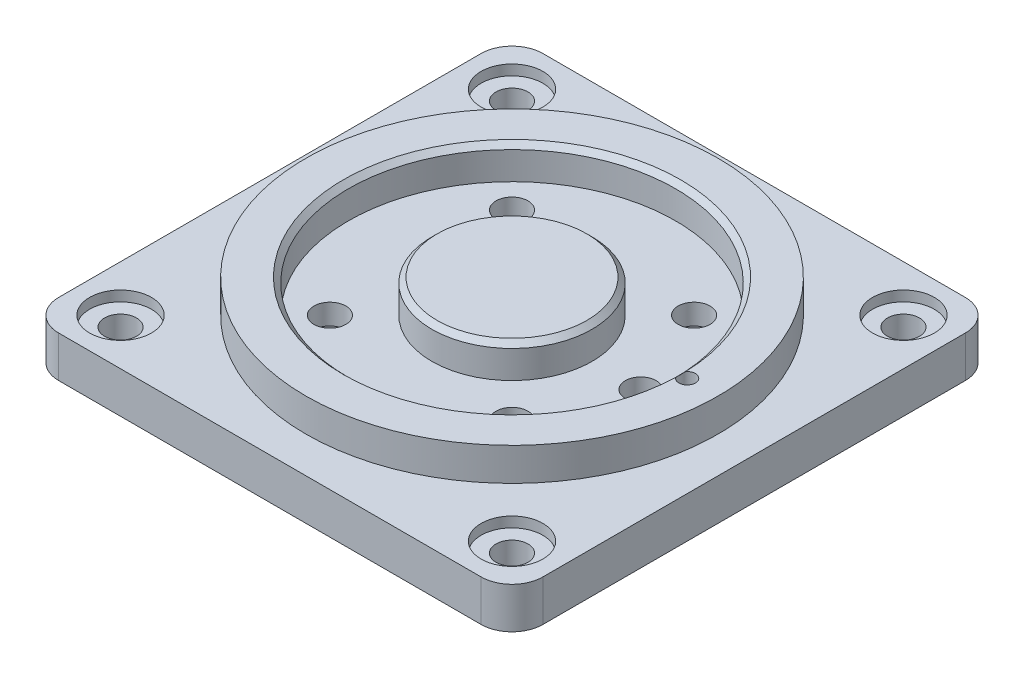
ISO-10303-21;
HEADER;
FILE_DESCRIPTION(('STEP AP214'),'2;1');
FILE_NAME('part.step','',(''),(''),'','','');
FILE_SCHEMA(('AUTOMOTIVE_DESIGN { 1 0 10303 214 1 1 1 1 }'));
ENDSEC;
DATA;
#1=APPLICATION_CONTEXT('core data for automotive mechanical design processes');
#2=APPLICATION_PROTOCOL_DEFINITION('international standard','automotive_design',2000,#1);
#3=PRODUCT_CONTEXT('',#1,'mechanical');
#4=PRODUCT('Part','Part','',(#3));
#5=PRODUCT_RELATED_PRODUCT_CATEGORY('part','',(#4));
#6=PRODUCT_DEFINITION_FORMATION('','',#4);
#7=PRODUCT_DEFINITION_CONTEXT('part definition',#1,'design');
#8=PRODUCT_DEFINITION('design','',#6,#7);
#9=PRODUCT_DEFINITION_SHAPE('','',#8);
#10=(LENGTH_UNIT() NAMED_UNIT(*) SI_UNIT(.MILLI.,.METRE.));
#11=(NAMED_UNIT(*) PLANE_ANGLE_UNIT() SI_UNIT($,.RADIAN.));
#12=(NAMED_UNIT(*) SI_UNIT($,.STERADIAN.) SOLID_ANGLE_UNIT());
#13=UNCERTAINTY_MEASURE_WITH_UNIT(LENGTH_MEASURE(1.E-05),#10,'distance_accuracy_value','');
#14=(GEOMETRIC_REPRESENTATION_CONTEXT(3) GLOBAL_UNCERTAINTY_ASSIGNED_CONTEXT((#13)) GLOBAL_UNIT_ASSIGNED_CONTEXT((#10,
#11,#12)) REPRESENTATION_CONTEXT('',''));
#15=CARTESIAN_POINT('',(0.,0.,0.));
#16=DIRECTION('',(0.,0.,1.));
#17=DIRECTION('',(1.,0.,0.));
#18=AXIS2_PLACEMENT_3D('',#15,#16,#17);
#19=CARTESIAN_POINT('',(-37.9999999999996,0.,-38.));
#20=DIRECTION('',(0.,1.,0.));
#21=DIRECTION('',(0.,0.,1.));
#22=AXIS2_PLACEMENT_3D('',#19,#20,#21);
#23=CYLINDRICAL_SURFACE('',#22,3.09999999999999);
#24=CARTESIAN_POINT('',(-37.9999999999996,0.,-38.));
#25=DIRECTION('',(0.,1.,0.));
#26=DIRECTION('',(0.,0.,1.));
#27=AXIS2_PLACEMENT_3D('',#24,#25,#26);
#28=CIRCLE('',#27,3.09999999999999);
#29=CARTESIAN_POINT('',(-37.9999999999996,0.,-34.9));
#30=VERTEX_POINT('',#29);
#31=EDGE_CURVE('E474',#30,#30,#28,.T.);
#32=ORIENTED_EDGE('',*,*,#31,.F.);
#33=EDGE_LOOP('',(#32));
#34=FACE_BOUND('',#33,.T.);
#35=CARTESIAN_POINT('',(-37.9999999999996,6.,-38.));
#36=DIRECTION('',(0.,1.,0.));
#37=DIRECTION('',(0.,0.,1.));
#38=AXIS2_PLACEMENT_3D('',#35,#36,#37);
#39=CIRCLE('',#38,3.09999999999999);
#40=CARTESIAN_POINT('',(-37.9999999999996,6.,-34.9));
#41=VERTEX_POINT('',#40);
#42=EDGE_CURVE('E50',#41,#41,#39,.F.);
#43=ORIENTED_EDGE('',*,*,#42,.F.);
#44=EDGE_LOOP('',(#43));
#45=FACE_BOUND('',#44,.T.);
#46=ADVANCED_FACE('F46',(#34,#45),#23,.F.);
#47=CARTESIAN_POINT('',(38.,0.,-38.0000000000019));
#48=DIRECTION('',(0.,1.,0.));
#49=DIRECTION('',(0.,0.,1.));
#50=AXIS2_PLACEMENT_3D('',#47,#48,#49);
#51=CYLINDRICAL_SURFACE('',#50,3.1);
#52=CARTESIAN_POINT('',(38.,0.,-38.0000000000019));
#53=DIRECTION('',(0.,1.,0.));
#54=DIRECTION('',(0.,0.,1.));
#55=AXIS2_PLACEMENT_3D('',#52,#53,#54);
#56=CIRCLE('',#55,3.1);
#57=CARTESIAN_POINT('',(38.,0.,-34.9000000000019));
#58=VERTEX_POINT('',#57);
#59=EDGE_CURVE('E471',#58,#58,#56,.T.);
#60=ORIENTED_EDGE('',*,*,#59,.F.);
#61=EDGE_LOOP('',(#60));
#62=FACE_BOUND('',#61,.T.);
#63=CARTESIAN_POINT('',(38.,6.,-38.0000000000019));
#64=DIRECTION('',(0.,1.,0.));
#65=DIRECTION('',(0.,0.,1.));
#66=AXIS2_PLACEMENT_3D('',#63,#64,#65);
#67=CIRCLE('',#66,3.1);
#68=CARTESIAN_POINT('',(38.,6.,-34.9000000000019));
#69=VERTEX_POINT('',#68);
#70=EDGE_CURVE('E610',#69,#69,#67,.F.);
#71=ORIENTED_EDGE('',*,*,#70,.F.);
#72=EDGE_LOOP('',(#71));
#73=FACE_BOUND('',#72,.T.);
#74=ADVANCED_FACE('F176',(#62,#73),#51,.F.);
#75=CARTESIAN_POINT('',(38.0000000000019,0.,37.9999999999977));
#76=DIRECTION('',(0.,1.,0.));
#77=DIRECTION('',(0.,0.,1.));
#78=AXIS2_PLACEMENT_3D('',#75,#76,#77);
#79=CYLINDRICAL_SURFACE('',#78,3.09999999999999);
#80=CARTESIAN_POINT('',(38.0000000000019,0.,37.9999999999977));
#81=DIRECTION('',(0.,1.,0.));
#82=DIRECTION('',(0.,0.,1.));
#83=AXIS2_PLACEMENT_3D('',#80,#81,#82);
#84=CIRCLE('',#83,3.09999999999999);
#85=CARTESIAN_POINT('',(38.0000000000019,0.,41.0999999999977));
#86=VERTEX_POINT('',#85);
#87=EDGE_CURVE('E475',#86,#86,#84,.T.);
#88=ORIENTED_EDGE('',*,*,#87,.F.);
#89=EDGE_LOOP('',(#88));
#90=FACE_BOUND('',#89,.T.);
#91=CARTESIAN_POINT('',(38.0000000000019,6.,37.9999999999977));
#92=DIRECTION('',(0.,1.,0.));
#93=DIRECTION('',(0.,0.,1.));
#94=AXIS2_PLACEMENT_3D('',#91,#92,#93);
#95=CIRCLE('',#94,3.09999999999999);
#96=CARTESIAN_POINT('',(38.0000000000019,6.,41.0999999999977));
#97=VERTEX_POINT('',#96);
#98=EDGE_CURVE('E608',#97,#97,#95,.F.);
#99=ORIENTED_EDGE('',*,*,#98,.F.);
#100=EDGE_LOOP('',(#99));
#101=FACE_BOUND('',#100,.T.);
#102=ADVANCED_FACE('F182',(#90,#101),#79,.F.);
#103=CARTESIAN_POINT('',(-37.9999999999977,0.,37.9999999999996));
#104=DIRECTION('',(0.,1.,0.));
#105=DIRECTION('',(0.,0.,1.));
#106=AXIS2_PLACEMENT_3D('',#103,#104,#105);
#107=CYLINDRICAL_SURFACE('',#106,3.09999999999999);
#108=CARTESIAN_POINT('',(-37.9999999999977,0.,37.9999999999996));
#109=DIRECTION('',(0.,1.,0.));
#110=DIRECTION('',(0.,0.,1.));
#111=AXIS2_PLACEMENT_3D('',#108,#109,#110);
#112=CIRCLE('',#111,3.09999999999999);
#113=CARTESIAN_POINT('',(-37.9999999999977,0.,41.0999999999996));
#114=VERTEX_POINT('',#113);
#115=EDGE_CURVE('E478',#114,#114,#112,.T.);
#116=ORIENTED_EDGE('',*,*,#115,.F.);
#117=EDGE_LOOP('',(#116));
#118=FACE_BOUND('',#117,.T.);
#119=CARTESIAN_POINT('',(-37.9999999999977,6.,37.9999999999996));
#120=DIRECTION('',(0.,1.,0.));
#121=DIRECTION('',(0.,0.,1.));
#122=AXIS2_PLACEMENT_3D('',#119,#120,#121);
#123=CIRCLE('',#122,3.09999999999999);
#124=CARTESIAN_POINT('',(-37.9999999999977,6.,41.0999999999996));
#125=VERTEX_POINT('',#124);
#126=EDGE_CURVE('E464',#125,#125,#123,.F.);
#127=ORIENTED_EDGE('',*,*,#126,.F.);
#128=EDGE_LOOP('',(#127));
#129=FACE_BOUND('',#128,.T.);
#130=ADVANCED_FACE('F189',(#118,#129),#107,.F.);
#131=CARTESIAN_POINT('',(0.,8.,0.));
#132=DIRECTION('',(0.,1.,0.));
#133=DIRECTION('',(0.,0.,1.));
#134=AXIS2_PLACEMENT_3D('',#131,#132,#133);
#135=PLANE('',#134);
#136=CARTESIAN_POINT('',(0.,8.,0.));
#137=DIRECTION('',(0.,1.,0.));
#138=DIRECTION('',(0.,0.,1.));
#139=AXIS2_PLACEMENT_3D('',#136,#137,#138);
#140=CIRCLE('',#139,15.55);
#141=CARTESIAN_POINT('',(0.,8.,15.55));
#142=VERTEX_POINT('',#141);
#143=EDGE_CURVE('E485',#142,#142,#140,.T.);
#144=ORIENTED_EDGE('',*,*,#143,.F.);
#145=EDGE_LOOP('',(#144));
#146=FACE_BOUND('',#145,.T.);
#147=CARTESIAN_POINT('',(-17.6776695296631,8.,-17.6776695296625));
#148=DIRECTION('',(0.,1.,0.));
#149=DIRECTION('',(0.,0.,1.));
#150=AXIS2_PLACEMENT_3D('',#147,#148,#149);
#151=CIRCLE('',#150,3.1);
#152=CARTESIAN_POINT('',(-17.6776695296631,8.,-14.5776695296625));
#153=VERTEX_POINT('',#152);
#154=EDGE_CURVE('E276',#153,#153,#151,.T.);
#155=ORIENTED_EDGE('',*,*,#154,.F.);
#156=EDGE_LOOP('',(#155));
#157=FACE_BOUND('',#156,.T.);
#158=CARTESIAN_POINT('',(25.,8.,0.));
#159=DIRECTION('',(0.,1.,0.));
#160=DIRECTION('',(0.,0.,1.));
#161=AXIS2_PLACEMENT_3D('',#158,#159,#160);
#162=CIRCLE('',#161,3.);
#163=CARTESIAN_POINT('',(25.,8.,3.00000000000009));
#164=VERTEX_POINT('',#163);
#165=EDGE_CURVE('E521',#164,#164,#162,.T.);
#166=ORIENTED_EDGE('',*,*,#165,.F.);
#167=EDGE_LOOP('',(#166));
#168=FACE_BOUND('',#167,.T.);
#169=CARTESIAN_POINT('',(17.6776695296636,8.,17.6776695296638));
#170=DIRECTION('',(0.,1.,0.));
#171=DIRECTION('',(0.,0.,1.));
#172=AXIS2_PLACEMENT_3D('',#169,#170,#171);
#173=CIRCLE('',#172,3.09999999999999);
#174=CARTESIAN_POINT('',(17.6776695296636,8.,20.7776695296638));
#175=VERTEX_POINT('',#174);
#176=EDGE_CURVE('E268',#175,#175,#173,.T.);
#177=ORIENTED_EDGE('',*,*,#176,.F.);
#178=EDGE_LOOP('',(#177));
#179=FACE_BOUND('',#178,.T.);
#180=CARTESIAN_POINT('',(-17.6776695296629,8.,17.677669529664));
#181=DIRECTION('',(0.,1.,0.));
#182=DIRECTION('',(0.,0.,1.));
#183=AXIS2_PLACEMENT_3D('',#180,#181,#182);
#184=CIRCLE('',#183,3.1);
#185=CARTESIAN_POINT('',(-17.6776695296629,8.,20.777669529664));
#186=VERTEX_POINT('',#185);
#187=EDGE_CURVE('E517',#186,#186,#184,.T.);
#188=ORIENTED_EDGE('',*,*,#187,.F.);
#189=EDGE_LOOP('',(#188));
#190=FACE_BOUND('',#189,.T.);
#191=CARTESIAN_POINT('',(17.6776695296634,8.,-17.6776695296627));
#192=DIRECTION('',(0.,1.,0.));
#193=DIRECTION('',(0.,0.,1.));
#194=AXIS2_PLACEMENT_3D('',#191,#192,#193);
#195=CIRCLE('',#194,3.1);
#196=CARTESIAN_POINT('',(17.6776695296634,8.,-14.5776695296627));
#197=VERTEX_POINT('',#196);
#198=EDGE_CURVE('E272',#197,#197,#195,.T.);
#199=ORIENTED_EDGE('',*,*,#198,.F.);
#200=EDGE_LOOP('',(#199));
#201=FACE_BOUND('',#200,.T.);
#202=CARTESIAN_POINT('',(0.,8.,0.));
#203=DIRECTION('',(0.,1.,0.));
#204=DIRECTION('',(0.,0.,1.));
#205=AXIS2_PLACEMENT_3D('',#202,#203,#204);
#206=CIRCLE('',#205,31.75);
#207=CARTESIAN_POINT('',(0.,8.,31.75));
#208=VERTEX_POINT('',#207);
#209=EDGE_CURVE('E283',#208,#208,#206,.F.);
#210=ORIENTED_EDGE('',*,*,#209,.F.);
#211=EDGE_LOOP('',(#210));
#212=FACE_BOUND('',#211,.T.);
#213=ADVANCED_FACE('F259',(#146,#157,#168,#179,#190,#201,#212),#135,.T.);
#214=CARTESIAN_POINT('',(17.6776695296636,8.,17.6776695296638));
#215=DIRECTION('',(0.,-1.,0.));
#216=DIRECTION('',(0.,0.,-1.));
#217=AXIS2_PLACEMENT_3D('',#214,#215,#216);
#218=CYLINDRICAL_SURFACE('',#217,3.09999999999999);
#219=ORIENTED_EDGE('',*,*,#176,.T.);
#220=EDGE_LOOP('',(#219));
#221=FACE_BOUND('',#220,.T.);
#222=CARTESIAN_POINT('',(17.6776695296636,4.,17.6776695296638));
#223=DIRECTION('',(0.,-1.,0.));
#224=DIRECTION('',(0.,0.,-1.));
#225=AXIS2_PLACEMENT_3D('',#222,#223,#224);
#226=CIRCLE('',#225,3.09999999999999);
#227=CARTESIAN_POINT('',(17.6776695296636,4.,14.5776695296638));
#228=VERTEX_POINT('',#227);
#229=EDGE_CURVE('E271',#228,#228,#226,.T.);
#230=ORIENTED_EDGE('',*,*,#229,.T.);
#231=EDGE_LOOP('',(#230));
#232=FACE_BOUND('',#231,.T.);
#233=ADVANCED_FACE('F254',(#221,#232),#218,.F.);
#234=CARTESIAN_POINT('',(-17.6776695296629,8.,17.677669529664));
#235=DIRECTION('',(0.,-1.,0.));
#236=DIRECTION('',(0.,0.,-1.));
#237=AXIS2_PLACEMENT_3D('',#234,#235,#236);
#238=CYLINDRICAL_SURFACE('',#237,3.1);
#239=ORIENTED_EDGE('',*,*,#187,.T.);
#240=EDGE_LOOP('',(#239));
#241=FACE_BOUND('',#240,.T.);
#242=CARTESIAN_POINT('',(-17.6776695296629,4.,17.677669529664));
#243=DIRECTION('',(0.,-1.,0.));
#244=DIRECTION('',(0.,0.,-1.));
#245=AXIS2_PLACEMENT_3D('',#242,#243,#244);
#246=CIRCLE('',#245,3.1);
#247=CARTESIAN_POINT('',(-17.6776695296629,4.,14.577669529664));
#248=VERTEX_POINT('',#247);
#249=EDGE_CURVE('E273',#248,#248,#246,.T.);
#250=ORIENTED_EDGE('',*,*,#249,.T.);
#251=EDGE_LOOP('',(#250));
#252=FACE_BOUND('',#251,.T.);
#253=ADVANCED_FACE('F250',(#241,#252),#238,.F.);
#254=CARTESIAN_POINT('',(-17.6776695296631,8.,-17.6776695296625));
#255=DIRECTION('',(0.,-1.,0.));
#256=DIRECTION('',(0.,0.,-1.));
#257=AXIS2_PLACEMENT_3D('',#254,#255,#256);
#258=CYLINDRICAL_SURFACE('',#257,3.1);
#259=ORIENTED_EDGE('',*,*,#154,.T.);
#260=EDGE_LOOP('',(#259));
#261=FACE_BOUND('',#260,.T.);
#262=CARTESIAN_POINT('',(-17.6776695296631,4.,-17.6776695296625));
#263=DIRECTION('',(0.,-1.,0.));
#264=DIRECTION('',(0.,0.,-1.));
#265=AXIS2_PLACEMENT_3D('',#262,#263,#264);
#266=CIRCLE('',#265,3.1);
#267=CARTESIAN_POINT('',(-17.6776695296631,4.,-20.7776695296625));
#268=VERTEX_POINT('',#267);
#269=EDGE_CURVE('E279',#268,#268,#266,.T.);
#270=ORIENTED_EDGE('',*,*,#269,.T.);
#271=EDGE_LOOP('',(#270));
#272=FACE_BOUND('',#271,.T.);
#273=ADVANCED_FACE('F246',(#261,#272),#258,.F.);
#274=CARTESIAN_POINT('',(17.6776695296634,8.,-17.6776695296627));
#275=DIRECTION('',(0.,-1.,0.));
#276=DIRECTION('',(0.,0.,-1.));
#277=AXIS2_PLACEMENT_3D('',#274,#275,#276);
#278=CYLINDRICAL_SURFACE('',#277,3.1);
#279=ORIENTED_EDGE('',*,*,#198,.T.);
#280=EDGE_LOOP('',(#279));
#281=FACE_BOUND('',#280,.T.);
#282=CARTESIAN_POINT('',(17.6776695296634,4.,-17.6776695296627));
#283=DIRECTION('',(0.,-1.,0.));
#284=DIRECTION('',(0.,0.,-1.));
#285=AXIS2_PLACEMENT_3D('',#282,#283,#284);
#286=CIRCLE('',#285,3.1);
#287=CARTESIAN_POINT('',(17.6776695296634,4.,-20.7776695296627));
#288=VERTEX_POINT('',#287);
#289=EDGE_CURVE('E512',#288,#288,#286,.T.);
#290=ORIENTED_EDGE('',*,*,#289,.T.);
#291=EDGE_LOOP('',(#290));
#292=FACE_BOUND('',#291,.T.);
#293=ADVANCED_FACE('F242',(#281,#292),#278,.F.);
#294=CARTESIAN_POINT('',(-38.,8.,37.9999999999996));
#295=DIRECTION('',(0.,1.,0.));
#296=DIRECTION('',(0.,0.,1.));
#297=AXIS2_PLACEMENT_3D('',#294,#295,#296);
#298=CIRCLE('',#297,5.99999999999999);
#299=CARTESIAN_POINT('',(-38.,8.,43.9999999999996));
#300=VERTEX_POINT('',#299);
#301=EDGE_CURVE('E831',#300,#300,#298,.T.);
#302=ORIENTED_EDGE('',*,*,#301,.F.);
#303=EDGE_LOOP('',(#302));
#304=FACE_BOUND('',#303,.T.);
#305=CARTESIAN_POINT('',(37.9999999999996,8.,38.));
#306=DIRECTION('',(0.,1.,0.));
#307=DIRECTION('',(0.,0.,1.));
#308=AXIS2_PLACEMENT_3D('',#305,#306,#307);
#309=CIRCLE('',#308,5.99999999999999);
#310=CARTESIAN_POINT('',(37.9999999999996,8.,44.));
#311=VERTEX_POINT('',#310);
#312=EDGE_CURVE('E837',#311,#311,#309,.T.);
#313=ORIENTED_EDGE('',*,*,#312,.F.);
#314=EDGE_LOOP('',(#313));
#315=FACE_BOUND('',#314,.T.);
#316=CARTESIAN_POINT('',(38.,8.,-37.9999999999996));
#317=DIRECTION('',(0.,1.,0.));
#318=DIRECTION('',(0.,0.,1.));
#319=AXIS2_PLACEMENT_3D('',#316,#317,#318);
#320=CIRCLE('',#319,5.99999999999999);
#321=CARTESIAN_POINT('',(38.,8.,-31.9999999999996));
#322=VERTEX_POINT('',#321);
#323=EDGE_CURVE('E467',#322,#322,#320,.T.);
#324=ORIENTED_EDGE('',*,*,#323,.F.);
#325=EDGE_LOOP('',(#324));
#326=FACE_BOUND('',#325,.T.);
#327=CARTESIAN_POINT('',(-37.9999999999996,8.,-38.));
#328=DIRECTION('',(0.,1.,0.));
#329=DIRECTION('',(0.,0.,1.));
#330=AXIS2_PLACEMENT_3D('',#327,#328,#329);
#331=CIRCLE('',#330,5.99999999999999);
#332=CARTESIAN_POINT('',(-37.9999999999996,8.,-32.));
#333=VERTEX_POINT('',#332);
#334=EDGE_CURVE('E460',#333,#333,#331,.T.);
#335=ORIENTED_EDGE('',*,*,#334,.F.);
#336=EDGE_LOOP('',(#335));
#337=FACE_BOUND('',#336,.T.);
#338=CARTESIAN_POINT('',(0.,8.,0.));
#339=DIRECTION('',(0.,1.,0.));
#340=DIRECTION('',(0.,0.,1.));
#341=AXIS2_PLACEMENT_3D('',#338,#339,#340);
#342=CIRCLE('',#341,40.);
#343=CARTESIAN_POINT('',(0.,8.,40.));
#344=VERTEX_POINT('',#343);
#345=EDGE_CURVE('E133',#344,#344,#342,.T.);
#346=ORIENTED_EDGE('',*,*,#345,.F.);
#347=EDGE_LOOP('',(#346));
#348=FACE_BOUND('',#347,.T.);
#349=DIRECTION('',(0.,0.,1.));
#350=VECTOR('',#349,1.);
#351=CARTESIAN_POINT('',(-47.,8.,-47.));
#352=LINE('',#351,#350);
#353=CARTESIAN_POINT('',(-47.,8.,-41.));
#354=VERTEX_POINT('',#353);
#355=CARTESIAN_POINT('',(-47.,8.,41.));
#356=VERTEX_POINT('',#355);
#357=EDGE_CURVE('E536',#354,#356,#352,.T.);
#358=ORIENTED_EDGE('',*,*,#357,.T.);
#359=CARTESIAN_POINT('',(-41.,8.,41.));
#360=DIRECTION('',(0.,1.,0.));
#361=DIRECTION('',(0.,0.,1.));
#362=AXIS2_PLACEMENT_3D('',#359,#360,#361);
#363=CIRCLE('',#362,6.);
#364=CARTESIAN_POINT('',(-41.,8.,47.));
#365=VERTEX_POINT('',#364);
#366=EDGE_CURVE('E602',#356,#365,#363,.T.);
#367=ORIENTED_EDGE('',*,*,#366,.T.);
#368=DIRECTION('',(1.,0.,0.));
#369=VECTOR('',#368,1.);
#370=CARTESIAN_POINT('',(-47.,8.,47.));
#371=LINE('',#370,#369);
#372=CARTESIAN_POINT('',(41.,8.,47.));
#373=VERTEX_POINT('',#372);
#374=EDGE_CURVE('E287',#365,#373,#371,.T.);
#375=ORIENTED_EDGE('',*,*,#374,.T.);
#376=CARTESIAN_POINT('',(41.,8.,41.));
#377=DIRECTION('',(0.,1.,0.));
#378=DIRECTION('',(0.,0.,1.));
#379=AXIS2_PLACEMENT_3D('',#376,#377,#378);
#380=CIRCLE('',#379,6.);
#381=CARTESIAN_POINT('',(47.,8.,41.));
#382=VERTEX_POINT('',#381);
#383=EDGE_CURVE('E598',#373,#382,#380,.T.);
#384=ORIENTED_EDGE('',*,*,#383,.T.);
#385=DIRECTION('',(0.,0.,-1.));
#386=VECTOR('',#385,1.);
#387=CARTESIAN_POINT('',(47.,8.,-47.));
#388=LINE('',#387,#386);
#389=CARTESIAN_POINT('',(47.,8.,-41.));
#390=VERTEX_POINT('',#389);
#391=EDGE_CURVE('E531',#382,#390,#388,.T.);
#392=ORIENTED_EDGE('',*,*,#391,.T.);
#393=CARTESIAN_POINT('',(41.,8.,-41.));
#394=DIRECTION('',(0.,1.,0.));
#395=DIRECTION('',(0.,0.,1.));
#396=AXIS2_PLACEMENT_3D('',#393,#394,#395);
#397=CIRCLE('',#396,6.);
#398=CARTESIAN_POINT('',(41.,8.,-47.));
#399=VERTEX_POINT('',#398);
#400=EDGE_CURVE('E69',#390,#399,#397,.T.);
#401=ORIENTED_EDGE('',*,*,#400,.T.);
#402=DIRECTION('',(-1.,0.,0.));
#403=VECTOR('',#402,1.);
#404=CARTESIAN_POINT('',(-47.,8.,-47.));
#405=LINE('',#404,#403);
#406=CARTESIAN_POINT('',(-41.,8.,-47.));
#407=VERTEX_POINT('',#406);
#408=EDGE_CURVE('E533',#399,#407,#405,.T.);
#409=ORIENTED_EDGE('',*,*,#408,.T.);
#410=CARTESIAN_POINT('',(-41.,8.,-41.));
#411=DIRECTION('',(0.,1.,0.));
#412=DIRECTION('',(0.,0.,1.));
#413=AXIS2_PLACEMENT_3D('',#410,#411,#412);
#414=CIRCLE('',#413,6.);
#415=EDGE_CURVE('E627',#407,#354,#414,.T.);
#416=ORIENTED_EDGE('',*,*,#415,.T.);
#417=EDGE_LOOP('',(#358,#367,#375,#384,#392,#401,#409,#416));
#418=FACE_BOUND('',#417,.T.);
#419=ADVANCED_FACE('F245',(#304,#315,#326,#337,#348,#418),#135,.T.);
#420=CARTESIAN_POINT('',(0.,0.,0.));
#421=DIRECTION('',(0.,1.,0.));
#422=DIRECTION('',(0.,0.,1.));
#423=AXIS2_PLACEMENT_3D('',#420,#421,#422);
#424=PLANE('',#423);
#425=ORIENTED_EDGE('',*,*,#115,.T.);
#426=EDGE_LOOP('',(#425));
#427=FACE_BOUND('',#426,.T.);
#428=ORIENTED_EDGE('',*,*,#87,.T.);
#429=EDGE_LOOP('',(#428));
#430=FACE_BOUND('',#429,.T.);
#431=ORIENTED_EDGE('',*,*,#59,.T.);
#432=EDGE_LOOP('',(#431));
#433=FACE_BOUND('',#432,.T.);
#434=ORIENTED_EDGE('',*,*,#31,.T.);
#435=EDGE_LOOP('',(#434));
#436=FACE_BOUND('',#435,.T.);
#437=CARTESIAN_POINT('',(-17.6776695296638,0.,17.6776695296636));
#438=DIRECTION('',(0.,-1.,0.));
#439=DIRECTION('',(0.,0.,-1.));
#440=AXIS2_PLACEMENT_3D('',#437,#438,#439);
#441=CIRCLE('',#440,7.00000000000001);
#442=CARTESIAN_POINT('',(-17.6776695296638,0.,10.6776695296636));
#443=VERTEX_POINT('',#442);
#444=EDGE_CURVE('E490',#443,#443,#441,.T.);
#445=ORIENTED_EDGE('',*,*,#444,.F.);
#446=EDGE_LOOP('',(#445));
#447=FACE_BOUND('',#446,.T.);
#448=CARTESIAN_POINT('',(-17.6776695296636,0.,-17.6776695296638));
#449=DIRECTION('',(0.,-1.,0.));
#450=DIRECTION('',(0.,0.,-1.));
#451=AXIS2_PLACEMENT_3D('',#448,#449,#450);
#452=CIRCLE('',#451,7.);
#453=CARTESIAN_POINT('',(-17.6776695296636,0.,-24.6776695296638));
#454=VERTEX_POINT('',#453);
#455=EDGE_CURVE('E501',#454,#454,#452,.T.);
#456=ORIENTED_EDGE('',*,*,#455,.F.);
#457=EDGE_LOOP('',(#456));
#458=FACE_BOUND('',#457,.T.);
#459=CARTESIAN_POINT('',(17.6776695296638,0.,-17.6776695296636));
#460=DIRECTION('',(0.,-1.,0.));
#461=DIRECTION('',(0.,0.,-1.));
#462=AXIS2_PLACEMENT_3D('',#459,#460,#461);
#463=CIRCLE('',#462,7.);
#464=CARTESIAN_POINT('',(17.6776695296638,0.,-24.6776695296636));
#465=VERTEX_POINT('',#464);
#466=EDGE_CURVE('E495',#465,#465,#463,.T.);
#467=ORIENTED_EDGE('',*,*,#466,.F.);
#468=EDGE_LOOP('',(#467));
#469=FACE_BOUND('',#468,.T.);
#470=CARTESIAN_POINT('',(17.6776695296636,0.,17.6776695296638));
#471=DIRECTION('',(0.,-1.,0.));
#472=DIRECTION('',(0.,0.,-1.));
#473=AXIS2_PLACEMENT_3D('',#470,#471,#472);
#474=CIRCLE('',#473,7.);
#475=CARTESIAN_POINT('',(17.6776695296636,0.,10.6776695296638));
#476=VERTEX_POINT('',#475);
#477=EDGE_CURVE('E494',#476,#476,#474,.T.);
#478=ORIENTED_EDGE('',*,*,#477,.F.);
#479=EDGE_LOOP('',(#478));
#480=FACE_BOUND('',#479,.T.);
#481=DIRECTION('',(1.,0.,0.));
#482=VECTOR('',#481,1.);
#483=CARTESIAN_POINT('',(-47.,0.,47.));
#484=LINE('',#483,#482);
#485=CARTESIAN_POINT('',(-41.,0.,47.));
#486=VERTEX_POINT('',#485);
#487=CARTESIAN_POINT('',(41.,0.,47.));
#488=VERTEX_POINT('',#487);
#489=EDGE_CURVE('E534',#486,#488,#484,.T.);
#490=ORIENTED_EDGE('',*,*,#489,.F.);
#491=CARTESIAN_POINT('',(-41.,0.,41.));
#492=DIRECTION('',(0.,1.,0.));
#493=DIRECTION('',(0.,0.,1.));
#494=AXIS2_PLACEMENT_3D('',#491,#492,#493);
#495=CIRCLE('',#494,6.);
#496=CARTESIAN_POINT('',(-47.,0.,41.));
#497=VERTEX_POINT('',#496);
#498=EDGE_CURVE('E634',#486,#497,#495,.F.);
#499=ORIENTED_EDGE('',*,*,#498,.T.);
#500=DIRECTION('',(0.,0.,1.));
#501=VECTOR('',#500,1.);
#502=CARTESIAN_POINT('',(-47.,0.,-47.));
#503=LINE('',#502,#501);
#504=CARTESIAN_POINT('',(-47.,0.,-41.));
#505=VERTEX_POINT('',#504);
#506=EDGE_CURVE('E545',#505,#497,#503,.T.);
#507=ORIENTED_EDGE('',*,*,#506,.F.);
#508=CARTESIAN_POINT('',(-41.,0.,-41.));
#509=DIRECTION('',(0.,1.,0.));
#510=DIRECTION('',(0.,0.,1.));
#511=AXIS2_PLACEMENT_3D('',#508,#509,#510);
#512=CIRCLE('',#511,6.);
#513=CARTESIAN_POINT('',(-41.,0.,-47.));
#514=VERTEX_POINT('',#513);
#515=EDGE_CURVE('E639',#505,#514,#512,.F.);
#516=ORIENTED_EDGE('',*,*,#515,.T.);
#517=DIRECTION('',(-1.,0.,0.));
#518=VECTOR('',#517,1.);
#519=CARTESIAN_POINT('',(-47.,0.,-47.));
#520=LINE('',#519,#518);
#521=CARTESIAN_POINT('',(41.,0.,-47.));
#522=VERTEX_POINT('',#521);
#523=EDGE_CURVE('E543',#522,#514,#520,.T.);
#524=ORIENTED_EDGE('',*,*,#523,.F.);
#525=CARTESIAN_POINT('',(41.,0.,-41.));
#526=DIRECTION('',(0.,1.,0.));
#527=DIRECTION('',(0.,0.,1.));
#528=AXIS2_PLACEMENT_3D('',#525,#526,#527);
#529=CIRCLE('',#528,6.);
#530=CARTESIAN_POINT('',(47.,0.,-41.));
#531=VERTEX_POINT('',#530);
#532=EDGE_CURVE('E637',#522,#531,#529,.F.);
#533=ORIENTED_EDGE('',*,*,#532,.T.);
#534=DIRECTION('',(0.,0.,-1.));
#535=VECTOR('',#534,1.);
#536=CARTESIAN_POINT('',(47.,0.,-47.));
#537=LINE('',#536,#535);
#538=CARTESIAN_POINT('',(47.,0.,41.));
#539=VERTEX_POINT('',#538);
#540=EDGE_CURVE('E530',#539,#531,#537,.T.);
#541=ORIENTED_EDGE('',*,*,#540,.F.);
#542=CARTESIAN_POINT('',(41.,0.,41.));
#543=DIRECTION('',(0.,1.,0.));
#544=DIRECTION('',(0.,0.,1.));
#545=AXIS2_PLACEMENT_3D('',#542,#543,#544);
#546=CIRCLE('',#545,6.);
#547=EDGE_CURVE('E599',#539,#488,#546,.F.);
#548=ORIENTED_EDGE('',*,*,#547,.T.);
#549=EDGE_LOOP('',(#490,#499,#507,#516,#524,#533,#541,#548));
#550=FACE_BOUND('',#549,.T.);
#551=CARTESIAN_POINT('',(34.,0.,1.14546566403566E-13));
#552=DIRECTION('',(0.,1.,0.));
#553=DIRECTION('',(0.,0.,1.));
#554=AXIS2_PLACEMENT_3D('',#551,#552,#553);
#555=CIRCLE('',#554,1.60000000000001);
#556=CARTESIAN_POINT('',(34.,0.,1.60000000000012));
#557=VERTEX_POINT('',#556);
#558=EDGE_CURVE('E527',#557,#557,#555,.T.);
#559=ORIENTED_EDGE('',*,*,#558,.T.);
#560=EDGE_LOOP('',(#559));
#561=FACE_BOUND('',#560,.T.);
#562=CARTESIAN_POINT('',(25.,0.,0.));
#563=DIRECTION('',(0.,1.,0.));
#564=DIRECTION('',(0.,0.,1.));
#565=AXIS2_PLACEMENT_3D('',#562,#563,#564);
#566=CIRCLE('',#565,3.);
#567=CARTESIAN_POINT('',(25.,0.,3.00000000000009));
#568=VERTEX_POINT('',#567);
#569=EDGE_CURVE('E520',#568,#568,#566,.T.);
#570=ORIENTED_EDGE('',*,*,#569,.T.);
#571=EDGE_LOOP('',(#570));
#572=FACE_BOUND('',#571,.T.);
#573=ADVANCED_FACE('F331',(#427,#430,#433,#436,#447,#458,#469,#480,#550,#561,#572),#424,.F.);
#574=CARTESIAN_POINT('',(47.,8.,-47.));
#575=DIRECTION('',(-1.,0.,0.));
#576=DIRECTION('',(0.,0.,1.));
#577=AXIS2_PLACEMENT_3D('',#574,#575,#576);
#578=PLANE('',#577);
#579=ORIENTED_EDGE('',*,*,#391,.F.);
#580=DIRECTION('',(0.,-1.,0.));
#581=VECTOR('',#580,1.);
#582=CARTESIAN_POINT('',(47.,8.,41.));
#583=LINE('',#582,#581);
#584=EDGE_CURVE('E592',#382,#539,#583,.T.);
#585=ORIENTED_EDGE('',*,*,#584,.T.);
#586=ORIENTED_EDGE('',*,*,#540,.T.);
#587=DIRECTION('',(0.,-1.,0.));
#588=VECTOR('',#587,1.);
#589=CARTESIAN_POINT('',(47.,8.,-41.));
#590=LINE('',#589,#588);
#591=EDGE_CURVE('E595',#531,#390,#590,.F.);
#592=ORIENTED_EDGE('',*,*,#591,.T.);
#593=EDGE_LOOP('',(#579,#585,#586,#592));
#594=FACE_BOUND('',#593,.T.);
#595=ADVANCED_FACE('F335',(#594),#578,.F.);
#596=CARTESIAN_POINT('',(-47.,8.,-47.));
#597=DIRECTION('',(0.,0.,1.));
#598=DIRECTION('',(1.,0.,0.));
#599=AXIS2_PLACEMENT_3D('',#596,#597,#598);
#600=PLANE('',#599);
#601=ORIENTED_EDGE('',*,*,#408,.F.);
#602=DIRECTION('',(0.,-1.,0.));
#603=VECTOR('',#602,1.);
#604=CARTESIAN_POINT('',(41.,8.,-47.));
#605=LINE('',#604,#603);
#606=EDGE_CURVE('E12',#399,#522,#605,.T.);
#607=ORIENTED_EDGE('',*,*,#606,.T.);
#608=ORIENTED_EDGE('',*,*,#523,.T.);
#609=DIRECTION('',(0.,-1.,0.));
#610=VECTOR('',#609,1.);
#611=CARTESIAN_POINT('',(-41.,8.,-47.));
#612=LINE('',#611,#610);
#613=EDGE_CURVE('E55',#514,#407,#612,.F.);
#614=ORIENTED_EDGE('',*,*,#613,.T.);
#615=EDGE_LOOP('',(#601,#607,#608,#614));
#616=FACE_BOUND('',#615,.T.);
#617=ADVANCED_FACE('F581',(#616),#600,.F.);
#618=CARTESIAN_POINT('',(-47.,8.,-47.));
#619=DIRECTION('',(1.,0.,0.));
#620=DIRECTION('',(0.,0.,-1.));
#621=AXIS2_PLACEMENT_3D('',#618,#619,#620);
#622=PLANE('',#621);
#623=ORIENTED_EDGE('',*,*,#506,.T.);
#624=DIRECTION('',(0.,-1.,0.));
#625=VECTOR('',#624,1.);
#626=CARTESIAN_POINT('',(-47.,8.,41.));
#627=LINE('',#626,#625);
#628=EDGE_CURVE('E629',#497,#356,#627,.F.);
#629=ORIENTED_EDGE('',*,*,#628,.T.);
#630=ORIENTED_EDGE('',*,*,#357,.F.);
#631=DIRECTION('',(0.,-1.,0.));
#632=VECTOR('',#631,1.);
#633=CARTESIAN_POINT('',(-47.,8.,-41.));
#634=LINE('',#633,#632);
#635=EDGE_CURVE('E631',#354,#505,#634,.T.);
#636=ORIENTED_EDGE('',*,*,#635,.T.);
#637=EDGE_LOOP('',(#623,#629,#630,#636));
#638=FACE_BOUND('',#637,.T.);
#639=ADVANCED_FACE('F576',(#638),#622,.F.);
#640=CARTESIAN_POINT('',(-47.,8.,47.));
#641=DIRECTION('',(0.,0.,-1.));
#642=DIRECTION('',(-1.,0.,0.));
#643=AXIS2_PLACEMENT_3D('',#640,#641,#642);
#644=PLANE('',#643);
#645=ORIENTED_EDGE('',*,*,#374,.F.);
#646=DIRECTION('',(0.,-1.,0.));
#647=VECTOR('',#646,1.);
#648=CARTESIAN_POINT('',(-41.,8.,47.));
#649=LINE('',#648,#647);
#650=EDGE_CURVE('E640',#365,#486,#649,.T.);
#651=ORIENTED_EDGE('',*,*,#650,.T.);
#652=ORIENTED_EDGE('',*,*,#489,.T.);
#653=DIRECTION('',(0.,-1.,0.));
#654=VECTOR('',#653,1.);
#655=CARTESIAN_POINT('',(41.,8.,47.));
#656=LINE('',#655,#654);
#657=EDGE_CURVE('E126',#488,#373,#656,.F.);
#658=ORIENTED_EDGE('',*,*,#657,.T.);
#659=EDGE_LOOP('',(#645,#651,#652,#658));
#660=FACE_BOUND('',#659,.T.);
#661=ADVANCED_FACE('F572',(#660),#644,.F.);
#662=CARTESIAN_POINT('',(34.,8.,1.14546566403566E-13));
#663=DIRECTION('',(0.,-1.,0.));
#664=DIRECTION('',(0.,0.,-1.));
#665=AXIS2_PLACEMENT_3D('',#662,#663,#664);
#666=CYLINDRICAL_SURFACE('',#665,1.60000000000001);
#667=ORIENTED_EDGE('',*,*,#558,.F.);
#668=EDGE_LOOP('',(#667));
#669=FACE_BOUND('',#668,.T.);
#670=CARTESIAN_POINT('',(34.,14.4,1.14546566403566E-13));
#671=DIRECTION('',(0.,1.,0.));
#672=DIRECTION('',(0.,0.,1.));
#673=AXIS2_PLACEMENT_3D('',#670,#671,#672);
#674=CIRCLE('',#673,1.60000000000001);
#675=CARTESIAN_POINT('',(32.735330882353,14.4,-0.980108168963866));
#676=VERTEX_POINT('',#675);
#677=CARTESIAN_POINT('',(32.735330882353,14.4,0.980108168964092));
#678=VERTEX_POINT('',#677);
#679=EDGE_CURVE('E122',#676,#678,#674,.F.);
#680=ORIENTED_EDGE('',*,*,#679,.F.);
#681=CARTESIAN_POINT('',(32.735330882353,14.4,-0.980108168963867));
#682=CARTESIAN_POINT('',(32.693813971204,14.3569012687219,-0.926573738839793));
#683=CARTESIAN_POINT('',(32.6546080645807,14.3161108209255,-0.868915247690244));
#684=CARTESIAN_POINT('',(32.5823821832226,14.2408479887409,-0.745326757052718));
#685=CARTESIAN_POINT('',(32.5494156360784,14.2064302235117,-0.67933273656151));
#686=CARTESIAN_POINT('',(32.4963200785117,14.1509296451828,-0.550486072126197));
#687=CARTESIAN_POINT('',(32.4750035270744,14.1286172553622,-0.488668157300686));
#688=CARTESIAN_POINT('',(32.4398348268073,14.0917802797665,-0.360906858717708));
#689=CARTESIAN_POINT('',(32.4259584980595,14.0772304672311,-0.294977625797057));
#690=CARTESIAN_POINT('',(32.4065614799075,14.0568864549133,-0.160072308337784));
#691=CARTESIAN_POINT('',(32.4010981691073,14.0511523807988,-0.0910785742629863));
#692=CARTESIAN_POINT('',(32.3992026104563,14.0491632513119,0.0472049203264875));
#693=CARTESIAN_POINT('',(32.4027736257663,14.0529116209584,0.116494778776281));
#694=CARTESIAN_POINT('',(32.4178570148927,14.0687342151273,0.246343867691172));
#695=CARTESIAN_POINT('',(32.4285746671637,14.0799751990926,0.307102959325113));
#696=CARTESIAN_POINT('',(32.4564065885251,14.1091413827483,0.425466647850125));
#697=CARTESIAN_POINT('',(32.4735250762672,14.1270709907474,0.483069135520869));
#698=CARTESIAN_POINT('',(32.5199223575281,14.1756127817543,0.612847970895248));
#699=CARTESIAN_POINT('',(32.5513545367775,14.2084622560889,0.683413173797852));
#700=CARTESIAN_POINT('',(32.6217421261694,14.2818832419728,0.816125929885166));
#701=CARTESIAN_POINT('',(32.6606974184984,14.3224546325952,0.878273614864017));
#702=CARTESIAN_POINT('',(32.7132315445564,14.3770511136895,0.951086489139088));
#703=CARTESIAN_POINT('',(32.7241961741947,14.3884404025999,0.965740242593626));
#704=CARTESIAN_POINT('',(32.735330882353,14.4,0.980108168964094));
#705=B_SPLINE_CURVE_WITH_KNOTS('',3,(#681,#682,#683,#684,#685,#686,#687,#688,#689,#690,#691,
#692,#693,#694,#695,#696,#697,#698,#699,#700,#701,#702,#703,#704),.UNSPECIFIED.,.F.,.F.,(4,2,2,
2,2,2,2,2,2,2,2,4),(0.,0.24121200339209,0.484404302616401,0.690811656127418,0.896544078524768,
1.10367352176195,1.31087778996809,1.49820388328626,1.68565365741002,1.93612437162012,
2.18659116372517,2.2512412949987),.UNSPECIFIED.);
#706=EDGE_CURVE('E119',#676,#678,#705,.T.);
#707=ORIENTED_EDGE('',*,*,#706,.T.);
#708=EDGE_LOOP('',(#680,#707));
#709=FACE_BOUND('',#708,.T.);
#710=ADVANCED_FACE('F121',(#669,#709),#666,.F.);
#711=CARTESIAN_POINT('',(25.,8.,0.));
#712=DIRECTION('',(0.,-1.,0.));
#713=DIRECTION('',(0.,0.,-1.));
#714=AXIS2_PLACEMENT_3D('',#711,#712,#713);
#715=CYLINDRICAL_SURFACE('',#714,3.);
#716=ORIENTED_EDGE('',*,*,#165,.T.);
#717=EDGE_LOOP('',(#716));
#718=FACE_BOUND('',#717,.T.);
#719=ORIENTED_EDGE('',*,*,#569,.F.);
#720=EDGE_LOOP('',(#719));
#721=FACE_BOUND('',#720,.T.);
#722=ADVANCED_FACE('F218',(#718,#721),#715,.F.);
#723=CARTESIAN_POINT('',(17.6776695296638,4.,-17.6776695296636));
#724=DIRECTION('',(0.,-1.,0.));
#725=DIRECTION('',(0.,0.,-1.));
#726=AXIS2_PLACEMENT_3D('',#723,#724,#725);
#727=CYLINDRICAL_SURFACE('',#726,7.);
#728=CARTESIAN_POINT('',(17.6776695296638,4.,-17.6776695296636));
#729=DIRECTION('',(0.,-1.,0.));
#730=DIRECTION('',(0.,0.,-1.));
#731=AXIS2_PLACEMENT_3D('',#728,#729,#730);
#732=CIRCLE('',#731,7.);
#733=CARTESIAN_POINT('',(17.6776695296638,4.,-24.6776695296636));
#734=VERTEX_POINT('',#733);
#735=EDGE_CURVE('E491',#734,#734,#732,.T.);
#736=ORIENTED_EDGE('',*,*,#735,.F.);
#737=EDGE_LOOP('',(#736));
#738=FACE_BOUND('',#737,.T.);
#739=ORIENTED_EDGE('',*,*,#466,.T.);
#740=EDGE_LOOP('',(#739));
#741=FACE_BOUND('',#740,.T.);
#742=ADVANCED_FACE('F214',(#738,#741),#727,.F.);
#743=CARTESIAN_POINT('',(17.6776695296638,4.,-17.6776695296636));
#744=DIRECTION('',(0.,-1.,0.));
#745=DIRECTION('',(0.,0.,-1.));
#746=AXIS2_PLACEMENT_3D('',#743,#744,#745);
#747=PLANE('',#746);
#748=ORIENTED_EDGE('',*,*,#289,.F.);
#749=EDGE_LOOP('',(#748));
#750=FACE_BOUND('',#749,.T.);
#751=ORIENTED_EDGE('',*,*,#735,.T.);
#752=EDGE_LOOP('',(#751));
#753=FACE_BOUND('',#752,.T.);
#754=ADVANCED_FACE('F210',(#750,#753),#747,.T.);
#755=CARTESIAN_POINT('',(-17.6776695296636,4.,-17.6776695296638));
#756=DIRECTION('',(0.,-1.,0.));
#757=DIRECTION('',(0.,0.,-1.));
#758=AXIS2_PLACEMENT_3D('',#755,#756,#757);
#759=CYLINDRICAL_SURFACE('',#758,7.);
#760=CARTESIAN_POINT('',(-17.6776695296636,4.,-17.6776695296638));
#761=DIRECTION('',(0.,-1.,0.));
#762=DIRECTION('',(0.,0.,-1.));
#763=AXIS2_PLACEMENT_3D('',#760,#761,#762);
#764=CIRCLE('',#763,7.);
#765=CARTESIAN_POINT('',(-17.6776695296636,4.,-24.6776695296638));
#766=VERTEX_POINT('',#765);
#767=EDGE_CURVE('E498',#766,#766,#764,.T.);
#768=ORIENTED_EDGE('',*,*,#767,.F.);
#769=EDGE_LOOP('',(#768));
#770=FACE_BOUND('',#769,.T.);
#771=ORIENTED_EDGE('',*,*,#455,.T.);
#772=EDGE_LOOP('',(#771));
#773=FACE_BOUND('',#772,.T.);
#774=ADVANCED_FACE('F213',(#770,#773),#759,.F.);
#775=CARTESIAN_POINT('',(-17.6776695296636,4.,-17.6776695296638));
#776=DIRECTION('',(0.,-1.,0.));
#777=DIRECTION('',(0.,0.,-1.));
#778=AXIS2_PLACEMENT_3D('',#775,#776,#777);
#779=PLANE('',#778);
#780=ORIENTED_EDGE('',*,*,#269,.F.);
#781=EDGE_LOOP('',(#780));
#782=FACE_BOUND('',#781,.T.);
#783=ORIENTED_EDGE('',*,*,#767,.T.);
#784=EDGE_LOOP('',(#783));
#785=FACE_BOUND('',#784,.T.);
#786=ADVANCED_FACE('F220',(#782,#785),#779,.T.);
#787=CARTESIAN_POINT('',(-17.6776695296638,4.,17.6776695296636));
#788=DIRECTION('',(0.,-1.,0.));
#789=DIRECTION('',(0.,0.,-1.));
#790=AXIS2_PLACEMENT_3D('',#787,#788,#789);
#791=CYLINDRICAL_SURFACE('',#790,7.00000000000001);
#792=CARTESIAN_POINT('',(-17.6776695296638,4.,17.6776695296636));
#793=DIRECTION('',(0.,-1.,0.));
#794=DIRECTION('',(0.,0.,-1.));
#795=AXIS2_PLACEMENT_3D('',#792,#793,#794);
#796=CIRCLE('',#795,7.00000000000001);
#797=CARTESIAN_POINT('',(-17.6776695296638,4.,10.6776695296636));
#798=VERTEX_POINT('',#797);
#799=EDGE_CURVE('E504',#798,#798,#796,.T.);
#800=ORIENTED_EDGE('',*,*,#799,.F.);
#801=EDGE_LOOP('',(#800));
#802=FACE_BOUND('',#801,.T.);
#803=ORIENTED_EDGE('',*,*,#444,.T.);
#804=EDGE_LOOP('',(#803));
#805=FACE_BOUND('',#804,.T.);
#806=ADVANCED_FACE('F223',(#802,#805),#791,.F.);
#807=CARTESIAN_POINT('',(-17.6776695296638,4.,17.6776695296636));
#808=DIRECTION('',(0.,-1.,0.));
#809=DIRECTION('',(0.,0.,-1.));
#810=AXIS2_PLACEMENT_3D('',#807,#808,#809);
#811=PLANE('',#810);
#812=ORIENTED_EDGE('',*,*,#249,.F.);
#813=EDGE_LOOP('',(#812));
#814=FACE_BOUND('',#813,.T.);
#815=ORIENTED_EDGE('',*,*,#799,.T.);
#816=EDGE_LOOP('',(#815));
#817=FACE_BOUND('',#816,.T.);
#818=ADVANCED_FACE('F228',(#814,#817),#811,.T.);
#819=CARTESIAN_POINT('',(17.6776695296636,4.,17.6776695296638));
#820=DIRECTION('',(0.,-1.,0.));
#821=DIRECTION('',(0.,0.,-1.));
#822=AXIS2_PLACEMENT_3D('',#819,#820,#821);
#823=CYLINDRICAL_SURFACE('',#822,7.);
#824=CARTESIAN_POINT('',(17.6776695296636,4.,17.6776695296638));
#825=DIRECTION('',(0.,-1.,0.));
#826=DIRECTION('',(0.,0.,-1.));
#827=AXIS2_PLACEMENT_3D('',#824,#825,#826);
#828=CIRCLE('',#827,7.);
#829=CARTESIAN_POINT('',(17.6776695296636,4.,10.6776695296638));
#830=VERTEX_POINT('',#829);
#831=EDGE_CURVE('E509',#830,#830,#828,.T.);
#832=ORIENTED_EDGE('',*,*,#831,.F.);
#833=EDGE_LOOP('',(#832));
#834=FACE_BOUND('',#833,.T.);
#835=ORIENTED_EDGE('',*,*,#477,.T.);
#836=EDGE_LOOP('',(#835));
#837=FACE_BOUND('',#836,.T.);
#838=ADVANCED_FACE('F231',(#834,#837),#823,.F.);
#839=CARTESIAN_POINT('',(17.6776695296636,4.,17.6776695296638));
#840=DIRECTION('',(0.,-1.,0.));
#841=DIRECTION('',(0.,0.,-1.));
#842=AXIS2_PLACEMENT_3D('',#839,#840,#841);
#843=PLANE('',#842);
#844=ORIENTED_EDGE('',*,*,#229,.F.);
#845=EDGE_LOOP('',(#844));
#846=FACE_BOUND('',#845,.T.);
#847=ORIENTED_EDGE('',*,*,#831,.T.);
#848=EDGE_LOOP('',(#847));
#849=FACE_BOUND('',#848,.T.);
#850=ADVANCED_FACE('F208',(#846,#849),#843,.T.);
#851=CARTESIAN_POINT('',(0.,14.4,0.));
#852=DIRECTION('',(0.,-1.,0.));
#853=DIRECTION('',(0.,0.,-1.));
#854=AXIS2_PLACEMENT_3D('',#851,#852,#853);
#855=CYLINDRICAL_SURFACE('',#854,15.55);
#856=CARTESIAN_POINT('',(0.,13.4,0.));
#857=DIRECTION('',(0.,1.,0.));
#858=DIRECTION('',(0.,0.,1.));
#859=AXIS2_PLACEMENT_3D('',#856,#857,#858);
#860=CIRCLE('',#859,15.55);
#861=CARTESIAN_POINT('',(0.,13.4,15.55));
#862=VERTEX_POINT('',#861);
#863=EDGE_CURVE('E140',#862,#862,#860,.F.);
#864=ORIENTED_EDGE('',*,*,#863,.T.);
#865=EDGE_LOOP('',(#864));
#866=FACE_BOUND('',#865,.T.);
#867=ORIENTED_EDGE('',*,*,#143,.T.);
#868=EDGE_LOOP('',(#867));
#869=FACE_BOUND('',#868,.T.);
#870=ADVANCED_FACE('F204',(#866,#869),#855,.T.);
#871=CARTESIAN_POINT('',(0.,14.4,0.));
#872=DIRECTION('',(0.,1.,0.));
#873=DIRECTION('',(0.,0.,1.));
#874=AXIS2_PLACEMENT_3D('',#871,#872,#873);
#875=PLANE('',#874);
#876=CARTESIAN_POINT('',(0.,14.4,0.));
#877=DIRECTION('',(0.,1.,0.));
#878=DIRECTION('',(0.,0.,1.));
#879=AXIS2_PLACEMENT_3D('',#876,#877,#878);
#880=CIRCLE('',#879,14.55);
#881=CARTESIAN_POINT('',(0.,14.4,14.55));
#882=VERTEX_POINT('',#881);
#883=EDGE_CURVE('E286',#882,#882,#880,.T.);
#884=ORIENTED_EDGE('',*,*,#883,.T.);
#885=EDGE_LOOP('',(#884));
#886=FACE_BOUND('',#885,.T.);
#887=ADVANCED_FACE('F200',(#886),#875,.T.);
#888=CARTESIAN_POINT('',(0.,14.4,0.));
#889=DIRECTION('',(0.,-1.,0.));
#890=DIRECTION('',(0.,0.,-1.));
#891=AXIS2_PLACEMENT_3D('',#888,#889,#890);
#892=CYLINDRICAL_SURFACE('',#891,31.75);
#893=CARTESIAN_POINT('',(0.,13.4,0.));
#894=DIRECTION('',(0.,1.,0.));
#895=DIRECTION('',(0.,0.,1.));
#896=AXIS2_PLACEMENT_3D('',#893,#894,#895);
#897=CIRCLE('',#896,31.75);
#898=CARTESIAN_POINT('',(0.,13.4,31.75));
#899=VERTEX_POINT('',#898);
#900=EDGE_CURVE('E137',#899,#899,#897,.T.);
#901=ORIENTED_EDGE('',*,*,#900,.T.);
#902=EDGE_LOOP('',(#901));
#903=FACE_BOUND('',#902,.T.);
#904=ORIENTED_EDGE('',*,*,#209,.T.);
#905=EDGE_LOOP('',(#904));
#906=FACE_BOUND('',#905,.T.);
#907=ADVANCED_FACE('F196',(#903,#906),#892,.F.);
#908=CARTESIAN_POINT('',(0.,14.4,0.));
#909=DIRECTION('',(0.,-1.,0.));
#910=DIRECTION('',(0.,0.,-1.));
#911=AXIS2_PLACEMENT_3D('',#908,#909,#910);
#912=CYLINDRICAL_SURFACE('',#911,40.);
#913=CARTESIAN_POINT('',(0.,14.4,0.));
#914=DIRECTION('',(0.,1.,0.));
#915=DIRECTION('',(0.,0.,1.));
#916=AXIS2_PLACEMENT_3D('',#913,#914,#915);
#917=CIRCLE('',#916,40.);
#918=CARTESIAN_POINT('',(0.,14.4,40.));
#919=VERTEX_POINT('',#918);
#920=EDGE_CURVE('E132',#919,#919,#917,.T.);
#921=ORIENTED_EDGE('',*,*,#920,.F.);
#922=EDGE_LOOP('',(#921));
#923=FACE_BOUND('',#922,.T.);
#924=ORIENTED_EDGE('',*,*,#345,.T.);
#925=EDGE_LOOP('',(#924));
#926=FACE_BOUND('',#925,.T.);
#927=ADVANCED_FACE('F193',(#923,#926),#912,.T.);
#928=CARTESIAN_POINT('',(0.,14.4,0.));
#929=DIRECTION('',(0.,1.,0.));
#930=DIRECTION('',(0.,0.,1.));
#931=AXIS2_PLACEMENT_3D('',#928,#929,#930);
#932=PLANE('',#931);
#933=ORIENTED_EDGE('',*,*,#679,.T.);
#934=CARTESIAN_POINT('',(0.,14.4,0.));
#935=DIRECTION('',(0.,1.,0.));
#936=DIRECTION('',(0.,0.,1.));
#937=AXIS2_PLACEMENT_3D('',#934,#935,#936);
#938=CIRCLE('',#937,32.75);
#939=EDGE_CURVE('E127',#678,#676,#938,.F.);
#940=ORIENTED_EDGE('',*,*,#939,.T.);
#941=EDGE_LOOP('',(#933,#940));
#942=FACE_BOUND('',#941,.T.);
#943=ORIENTED_EDGE('',*,*,#920,.T.);
#944=EDGE_LOOP('',(#943));
#945=FACE_BOUND('',#944,.T.);
#946=ADVANCED_FACE('F130',(#942,#945),#932,.T.);
#947=CARTESIAN_POINT('',(0.,14.4,0.));
#948=DIRECTION('',(0.,-1.,0.));
#949=DIRECTION('',(0.,0.,-1.));
#950=AXIS2_PLACEMENT_3D('',#947,#948,#949);
#951=CONICAL_SURFACE('',#950,14.55,0.785398163397441);
#952=ORIENTED_EDGE('',*,*,#863,.F.);
#953=EDGE_LOOP('',(#952));
#954=FACE_BOUND('',#953,.T.);
#955=ORIENTED_EDGE('',*,*,#883,.F.);
#956=EDGE_LOOP('',(#955));
#957=FACE_BOUND('',#956,.T.);
#958=ADVANCED_FACE('F159',(#954,#957),#951,.T.);
#959=CARTESIAN_POINT('',(0.,13.4,0.));
#960=DIRECTION('',(0.,1.,0.));
#961=DIRECTION('',(0.,0.,1.));
#962=AXIS2_PLACEMENT_3D('',#959,#960,#961);
#963=CONICAL_SURFACE('',#962,31.75,0.785398163397448);
#964=ORIENTED_EDGE('',*,*,#706,.F.);
#965=ORIENTED_EDGE('',*,*,#939,.F.);
#966=EDGE_LOOP('',(#964,#965));
#967=FACE_BOUND('',#966,.T.);
#968=ORIENTED_EDGE('',*,*,#900,.F.);
#969=EDGE_LOOP('',(#968));
#970=FACE_BOUND('',#969,.T.);
#971=ADVANCED_FACE('F135',(#967,#970),#963,.F.);
#972=CARTESIAN_POINT('',(-41.,8.,41.));
#973=DIRECTION('',(0.,-1.,0.));
#974=DIRECTION('',(0.,0.,-1.));
#975=AXIS2_PLACEMENT_3D('',#972,#973,#974);
#976=CYLINDRICAL_SURFACE('',#975,6.);
#977=ORIENTED_EDGE('',*,*,#366,.F.);
#978=ORIENTED_EDGE('',*,*,#628,.F.);
#979=ORIENTED_EDGE('',*,*,#498,.F.);
#980=ORIENTED_EDGE('',*,*,#650,.F.);
#981=EDGE_LOOP('',(#977,#978,#979,#980));
#982=FACE_BOUND('',#981,.T.);
#983=ADVANCED_FACE('F158',(#982),#976,.T.);
#984=CARTESIAN_POINT('',(41.,8.,41.));
#985=DIRECTION('',(0.,-1.,0.));
#986=DIRECTION('',(0.,0.,-1.));
#987=AXIS2_PLACEMENT_3D('',#984,#985,#986);
#988=CYLINDRICAL_SURFACE('',#987,6.);
#989=ORIENTED_EDGE('',*,*,#383,.F.);
#990=ORIENTED_EDGE('',*,*,#657,.F.);
#991=ORIENTED_EDGE('',*,*,#547,.F.);
#992=ORIENTED_EDGE('',*,*,#584,.F.);
#993=EDGE_LOOP('',(#989,#990,#991,#992));
#994=FACE_BOUND('',#993,.T.);
#995=ADVANCED_FACE('F163',(#994),#988,.T.);
#996=CARTESIAN_POINT('',(41.,8.,-41.));
#997=DIRECTION('',(0.,-1.,0.));
#998=DIRECTION('',(0.,0.,-1.));
#999=AXIS2_PLACEMENT_3D('',#996,#997,#998);
#1000=CYLINDRICAL_SURFACE('',#999,6.);
#1001=ORIENTED_EDGE('',*,*,#400,.F.);
#1002=ORIENTED_EDGE('',*,*,#591,.F.);
#1003=ORIENTED_EDGE('',*,*,#532,.F.);
#1004=ORIENTED_EDGE('',*,*,#606,.F.);
#1005=EDGE_LOOP('',(#1001,#1002,#1003,#1004));
#1006=FACE_BOUND('',#1005,.T.);
#1007=ADVANCED_FACE('F166',(#1006),#1000,.T.);
#1008=CARTESIAN_POINT('',(-41.,8.,-41.));
#1009=DIRECTION('',(0.,-1.,0.));
#1010=DIRECTION('',(0.,0.,-1.));
#1011=AXIS2_PLACEMENT_3D('',#1008,#1009,#1010);
#1012=CYLINDRICAL_SURFACE('',#1011,6.);
#1013=ORIENTED_EDGE('',*,*,#415,.F.);
#1014=ORIENTED_EDGE('',*,*,#613,.F.);
#1015=ORIENTED_EDGE('',*,*,#515,.F.);
#1016=ORIENTED_EDGE('',*,*,#635,.F.);
#1017=EDGE_LOOP('',(#1013,#1014,#1015,#1016));
#1018=FACE_BOUND('',#1017,.T.);
#1019=ADVANCED_FACE('F48',(#1018),#1012,.T.);
#1020=CARTESIAN_POINT('',(-38.,6.,37.9999999999996));
#1021=DIRECTION('',(0.,1.,0.));
#1022=DIRECTION('',(0.,0.,1.));
#1023=AXIS2_PLACEMENT_3D('',#1020,#1021,#1022);
#1024=PLANE('',#1023);
#1025=CARTESIAN_POINT('',(-38.,6.,37.9999999999996));
#1026=DIRECTION('',(0.,1.,0.));
#1027=DIRECTION('',(0.,0.,1.));
#1028=AXIS2_PLACEMENT_3D('',#1025,#1026,#1027);
#1029=CIRCLE('',#1028,5.99999999999999);
#1030=CARTESIAN_POINT('',(-38.,6.,43.9999999999996));
#1031=VERTEX_POINT('',#1030);
#1032=EDGE_CURVE('E834',#1031,#1031,#1029,.T.);
#1033=ORIENTED_EDGE('',*,*,#1032,.T.);
#1034=EDGE_LOOP('',(#1033));
#1035=FACE_BOUND('',#1034,.T.);
#1036=ORIENTED_EDGE('',*,*,#126,.T.);
#1037=EDGE_LOOP('',(#1036));
#1038=FACE_BOUND('',#1037,.T.);
#1039=ADVANCED_FACE('F173',(#1035,#1038),#1024,.T.);
#1040=CARTESIAN_POINT('',(-38.,6.,37.9999999999996));
#1041=DIRECTION('',(0.,1.,0.));
#1042=DIRECTION('',(0.,0.,1.));
#1043=AXIS2_PLACEMENT_3D('',#1040,#1041,#1042);
#1044=CYLINDRICAL_SURFACE('',#1043,5.99999999999999);
#1045=ORIENTED_EDGE('',*,*,#1032,.F.);
#1046=EDGE_LOOP('',(#1045));
#1047=FACE_BOUND('',#1046,.T.);
#1048=ORIENTED_EDGE('',*,*,#301,.T.);
#1049=EDGE_LOOP('',(#1048));
#1050=FACE_BOUND('',#1049,.T.);
#1051=ADVANCED_FACE('F380',(#1047,#1050),#1044,.F.);
#1052=CARTESIAN_POINT('',(37.9999999999996,6.,38.));
#1053=DIRECTION('',(0.,1.,0.));
#1054=DIRECTION('',(0.,0.,1.));
#1055=AXIS2_PLACEMENT_3D('',#1052,#1053,#1054);
#1056=PLANE('',#1055);
#1057=CARTESIAN_POINT('',(37.9999999999996,6.,38.));
#1058=DIRECTION('',(0.,1.,0.));
#1059=DIRECTION('',(0.,0.,1.));
#1060=AXIS2_PLACEMENT_3D('',#1057,#1058,#1059);
#1061=CIRCLE('',#1060,5.99999999999999);
#1062=CARTESIAN_POINT('',(37.9999999999996,6.,44.));
#1063=VERTEX_POINT('',#1062);
#1064=EDGE_CURVE('E840',#1063,#1063,#1061,.T.);
#1065=ORIENTED_EDGE('',*,*,#1064,.T.);
#1066=EDGE_LOOP('',(#1065));
#1067=FACE_BOUND('',#1066,.T.);
#1068=ORIENTED_EDGE('',*,*,#98,.T.);
#1069=EDGE_LOOP('',(#1068));
#1070=FACE_BOUND('',#1069,.T.);
#1071=ADVANCED_FACE('F390',(#1067,#1070),#1056,.T.);
#1072=CARTESIAN_POINT('',(37.9999999999996,6.,38.));
#1073=DIRECTION('',(0.,1.,0.));
#1074=DIRECTION('',(0.,0.,1.));
#1075=AXIS2_PLACEMENT_3D('',#1072,#1073,#1074);
#1076=CYLINDRICAL_SURFACE('',#1075,5.99999999999999);
#1077=ORIENTED_EDGE('',*,*,#1064,.F.);
#1078=EDGE_LOOP('',(#1077));
#1079=FACE_BOUND('',#1078,.T.);
#1080=ORIENTED_EDGE('',*,*,#312,.T.);
#1081=EDGE_LOOP('',(#1080));
#1082=FACE_BOUND('',#1081,.T.);
#1083=ADVANCED_FACE('F400',(#1079,#1082),#1076,.F.);
#1084=CARTESIAN_POINT('',(38.,6.,-37.9999999999996));
#1085=DIRECTION('',(0.,1.,0.));
#1086=DIRECTION('',(0.,0.,1.));
#1087=AXIS2_PLACEMENT_3D('',#1084,#1085,#1086);
#1088=PLANE('',#1087);
#1089=CARTESIAN_POINT('',(38.,6.,-37.9999999999996));
#1090=DIRECTION('',(0.,1.,0.));
#1091=DIRECTION('',(0.,0.,1.));
#1092=AXIS2_PLACEMENT_3D('',#1089,#1090,#1091);
#1093=CIRCLE('',#1092,5.99999999999999);
#1094=CARTESIAN_POINT('',(38.,6.,-31.9999999999996));
#1095=VERTEX_POINT('',#1094);
#1096=EDGE_CURVE('E462',#1095,#1095,#1093,.T.);
#1097=ORIENTED_EDGE('',*,*,#1096,.T.);
#1098=EDGE_LOOP('',(#1097));
#1099=FACE_BOUND('',#1098,.T.);
#1100=ORIENTED_EDGE('',*,*,#70,.T.);
#1101=EDGE_LOOP('',(#1100));
#1102=FACE_BOUND('',#1101,.T.);
#1103=ADVANCED_FACE('F410',(#1099,#1102),#1088,.T.);
#1104=CARTESIAN_POINT('',(38.,6.,-37.9999999999996));
#1105=DIRECTION('',(0.,1.,0.));
#1106=DIRECTION('',(0.,0.,1.));
#1107=AXIS2_PLACEMENT_3D('',#1104,#1105,#1106);
#1108=CYLINDRICAL_SURFACE('',#1107,5.99999999999999);
#1109=ORIENTED_EDGE('',*,*,#1096,.F.);
#1110=EDGE_LOOP('',(#1109));
#1111=FACE_BOUND('',#1110,.T.);
#1112=ORIENTED_EDGE('',*,*,#323,.T.);
#1113=EDGE_LOOP('',(#1112));
#1114=FACE_BOUND('',#1113,.T.);
#1115=ADVANCED_FACE('F420',(#1111,#1114),#1108,.F.);
#1116=CARTESIAN_POINT('',(-37.9999999999996,6.,-38.));
#1117=DIRECTION('',(0.,1.,0.));
#1118=DIRECTION('',(0.,0.,1.));
#1119=AXIS2_PLACEMENT_3D('',#1116,#1117,#1118);
#1120=PLANE('',#1119);
#1121=CARTESIAN_POINT('',(-37.9999999999996,6.,-38.));
#1122=DIRECTION('',(0.,1.,0.));
#1123=DIRECTION('',(0.,0.,1.));
#1124=AXIS2_PLACEMENT_3D('',#1121,#1122,#1123);
#1125=CIRCLE('',#1124,5.99999999999999);
#1126=CARTESIAN_POINT('',(-37.9999999999996,6.,-32.));
#1127=VERTEX_POINT('',#1126);
#1128=EDGE_CURVE('E457',#1127,#1127,#1125,.T.);
#1129=ORIENTED_EDGE('',*,*,#1128,.T.);
#1130=EDGE_LOOP('',(#1129));
#1131=FACE_BOUND('',#1130,.T.);
#1132=ORIENTED_EDGE('',*,*,#42,.T.);
#1133=EDGE_LOOP('',(#1132));
#1134=FACE_BOUND('',#1133,.T.);
#1135=ADVANCED_FACE('F430',(#1131,#1134),#1120,.T.);
#1136=CARTESIAN_POINT('',(-37.9999999999996,6.,-38.));
#1137=DIRECTION('',(0.,1.,0.));
#1138=DIRECTION('',(0.,0.,1.));
#1139=AXIS2_PLACEMENT_3D('',#1136,#1137,#1138);
#1140=CYLINDRICAL_SURFACE('',#1139,5.99999999999999);
#1141=ORIENTED_EDGE('',*,*,#1128,.F.);
#1142=EDGE_LOOP('',(#1141));
#1143=FACE_BOUND('',#1142,.T.);
#1144=ORIENTED_EDGE('',*,*,#334,.T.);
#1145=EDGE_LOOP('',(#1144));
#1146=FACE_BOUND('',#1145,.T.);
#1147=ADVANCED_FACE('F440',(#1143,#1146),#1140,.F.);
#1148=CLOSED_SHELL('',(#46,#74,#102,#130,#213,#233,#253,#273,#293,#419,#573,#595,#617,#639,#661,
#710,#722,#742,#754,#774,#786,#806,#818,#838,#850,#870,#887,#907,#927,#946,#958,#971,#983,#995,
#1007,#1019,#1039,#1051,#1071,#1083,#1103,#1115,#1135,#1147));
#1149=MANIFOLD_SOLID_BREP('B2',#1148);
#1150=ADVANCED_BREP_SHAPE_REPRESENTATION('',(#18,#1149),#14);
#1151=SHAPE_DEFINITION_REPRESENTATION(#9,#1150);
ENDSEC;
END-ISO-10303-21;
